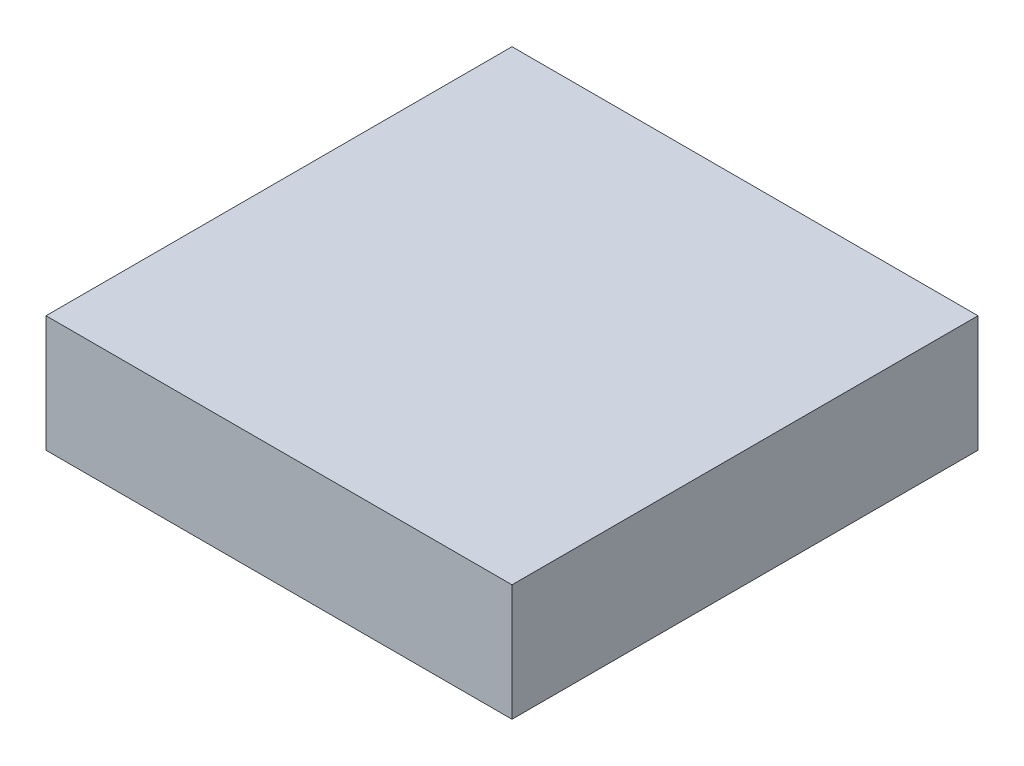
ISO-10303-21;
HEADER;
FILE_DESCRIPTION(('STEP AP214'),'2;1');
FILE_NAME('part.step','',(''),(''),'','','');
FILE_SCHEMA(('AUTOMOTIVE_DESIGN { 1 0 10303 214 1 1 1 1 }'));
ENDSEC;
DATA;
#1=APPLICATION_CONTEXT('core data for automotive mechanical design processes');
#2=APPLICATION_PROTOCOL_DEFINITION('international standard','automotive_design',2000,#1);
#3=PRODUCT_CONTEXT('',#1,'mechanical');
#4=PRODUCT('Part','Part','',(#3));
#5=PRODUCT_RELATED_PRODUCT_CATEGORY('part','',(#4));
#6=PRODUCT_DEFINITION_FORMATION('','',#4);
#7=PRODUCT_DEFINITION_CONTEXT('part definition',#1,'design');
#8=PRODUCT_DEFINITION('design','',#6,#7);
#9=PRODUCT_DEFINITION_SHAPE('','',#8);
#10=(LENGTH_UNIT() NAMED_UNIT(*) SI_UNIT(.MILLI.,.METRE.));
#11=(NAMED_UNIT(*) PLANE_ANGLE_UNIT() SI_UNIT($,.RADIAN.));
#12=(NAMED_UNIT(*) SI_UNIT($,.STERADIAN.) SOLID_ANGLE_UNIT());
#13=UNCERTAINTY_MEASURE_WITH_UNIT(LENGTH_MEASURE(1.E-05),#10,'distance_accuracy_value','');
#14=(GEOMETRIC_REPRESENTATION_CONTEXT(3) GLOBAL_UNCERTAINTY_ASSIGNED_CONTEXT((#13)) GLOBAL_UNIT_ASSIGNED_CONTEXT((#10,
#11,#12)) REPRESENTATION_CONTEXT('',''));
#15=CARTESIAN_POINT('',(0.,0.,0.));
#16=DIRECTION('',(0.,0.,1.));
#17=DIRECTION('',(1.,0.,0.));
#18=AXIS2_PLACEMENT_3D('',#15,#16,#17);
#19=CARTESIAN_POINT('',(-0.886029411764705,0.5,-0.983455882352941));
#20=DIRECTION('',(1.,0.,0.));
#21=DIRECTION('',(0.,0.,-1.));
#22=AXIS2_PLACEMENT_3D('',#19,#20,#21);
#23=PLANE('',#22);
#24=DIRECTION('',(0.,0.,1.));
#25=VECTOR('',#24,1.);
#26=CARTESIAN_POINT('',(-0.886029411764705,0.,-0.983455882352941));
#27=LINE('',#26,#25);
#28=CARTESIAN_POINT('',(-0.886029411764705,0.,-0.983455882352941));
#29=VERTEX_POINT('',#28);
#30=CARTESIAN_POINT('',(-0.886029411764705,0.,1.01654411764706));
#31=VERTEX_POINT('',#30);
#32=EDGE_CURVE('E99',#29,#31,#27,.T.);
#33=ORIENTED_EDGE('',*,*,#32,.T.);
#34=DIRECTION('',(0.,-1.,0.));
#35=VECTOR('',#34,1.);
#36=CARTESIAN_POINT('',(-0.886029411764705,0.5,1.01654411764706));
#37=LINE('',#36,#35);
#38=CARTESIAN_POINT('',(-0.886029411764705,0.5,1.01654411764706));
#39=VERTEX_POINT('',#38);
#40=EDGE_CURVE('E11',#39,#31,#37,.T.);
#41=ORIENTED_EDGE('',*,*,#40,.F.);
#42=DIRECTION('',(0.,0.,1.));
#43=VECTOR('',#42,1.);
#44=CARTESIAN_POINT('',(-0.886029411764705,0.5,-0.983455882352941));
#45=LINE('',#44,#43);
#46=CARTESIAN_POINT('',(-0.886029411764705,0.5,-0.983455882352941));
#47=VERTEX_POINT('',#46);
#48=EDGE_CURVE('E88',#47,#39,#45,.T.);
#49=ORIENTED_EDGE('',*,*,#48,.F.);
#50=DIRECTION('',(0.,-1.,0.));
#51=VECTOR('',#50,1.);
#52=CARTESIAN_POINT('',(-0.886029411764705,0.5,-0.983455882352941));
#53=LINE('',#52,#51);
#54=EDGE_CURVE('E96',#47,#29,#53,.T.);
#55=ORIENTED_EDGE('',*,*,#54,.T.);
#56=EDGE_LOOP('',(#33,#41,#49,#55));
#57=FACE_BOUND('',#56,.T.);
#58=ADVANCED_FACE('F40',(#57),#23,.F.);
#59=CARTESIAN_POINT('',(-0.886029411764705,0.5,1.01654411764706));
#60=DIRECTION('',(0.,0.,-1.));
#61=DIRECTION('',(-1.,0.,0.));
#62=AXIS2_PLACEMENT_3D('',#59,#60,#61);
#63=PLANE('',#62);
#64=DIRECTION('',(1.,0.,0.));
#65=VECTOR('',#64,1.);
#66=CARTESIAN_POINT('',(-0.886029411764705,0.,1.01654411764706));
#67=LINE('',#66,#65);
#68=CARTESIAN_POINT('',(1.1139705882353,0.,1.01654411764706));
#69=VERTEX_POINT('',#68);
#70=EDGE_CURVE('E95',#31,#69,#67,.T.);
#71=ORIENTED_EDGE('',*,*,#70,.T.);
#72=DIRECTION('',(0.,-1.,0.));
#73=VECTOR('',#72,1.);
#74=CARTESIAN_POINT('',(1.1139705882353,0.5,1.01654411764706));
#75=LINE('',#74,#73);
#76=CARTESIAN_POINT('',(1.1139705882353,0.5,1.01654411764706));
#77=VERTEX_POINT('',#76);
#78=EDGE_CURVE('E44',#77,#69,#75,.T.);
#79=ORIENTED_EDGE('',*,*,#78,.F.);
#80=DIRECTION('',(1.,0.,0.));
#81=VECTOR('',#80,1.);
#82=CARTESIAN_POINT('',(-0.886029411764705,0.5,1.01654411764706));
#83=LINE('',#82,#81);
#84=EDGE_CURVE('E81',#39,#77,#83,.T.);
#85=ORIENTED_EDGE('',*,*,#84,.F.);
#86=ORIENTED_EDGE('',*,*,#40,.T.);
#87=EDGE_LOOP('',(#71,#79,#85,#86));
#88=FACE_BOUND('',#87,.T.);
#89=ADVANCED_FACE('F91',(#88),#63,.F.);
#90=CARTESIAN_POINT('',(1.1139705882353,0.5,-0.983455882352941));
#91=DIRECTION('',(-1.,0.,0.));
#92=DIRECTION('',(0.,0.,1.));
#93=AXIS2_PLACEMENT_3D('',#90,#91,#92);
#94=PLANE('',#93);
#95=DIRECTION('',(0.,0.,-1.));
#96=VECTOR('',#95,1.);
#97=CARTESIAN_POINT('',(1.1139705882353,0.,-0.983455882352941));
#98=LINE('',#97,#96);
#99=CARTESIAN_POINT('',(1.1139705882353,0.,-0.983455882352941));
#100=VERTEX_POINT('',#99);
#101=EDGE_CURVE('E68',#69,#100,#98,.T.);
#102=ORIENTED_EDGE('',*,*,#101,.T.);
#103=DIRECTION('',(0.,-1.,0.));
#104=VECTOR('',#103,1.);
#105=CARTESIAN_POINT('',(1.1139705882353,0.5,-0.983455882352941));
#106=LINE('',#105,#104);
#107=CARTESIAN_POINT('',(1.1139705882353,0.5,-0.983455882352941));
#108=VERTEX_POINT('',#107);
#109=EDGE_CURVE('E93',#108,#100,#106,.T.);
#110=ORIENTED_EDGE('',*,*,#109,.F.);
#111=DIRECTION('',(0.,0.,-1.));
#112=VECTOR('',#111,1.);
#113=CARTESIAN_POINT('',(1.1139705882353,0.5,-0.983455882352941));
#114=LINE('',#113,#112);
#115=EDGE_CURVE('E86',#77,#108,#114,.T.);
#116=ORIENTED_EDGE('',*,*,#115,.F.);
#117=ORIENTED_EDGE('',*,*,#78,.T.);
#118=EDGE_LOOP('',(#102,#110,#116,#117));
#119=FACE_BOUND('',#118,.T.);
#120=ADVANCED_FACE('F92',(#119),#94,.F.);
#121=CARTESIAN_POINT('',(-0.886029411764705,0.5,-0.983455882352941));
#122=DIRECTION('',(0.,0.,1.));
#123=DIRECTION('',(1.,0.,0.));
#124=AXIS2_PLACEMENT_3D('',#121,#122,#123);
#125=PLANE('',#124);
#126=DIRECTION('',(-1.,0.,0.));
#127=VECTOR('',#126,1.);
#128=CARTESIAN_POINT('',(-0.886029411764705,0.,-0.983455882352941));
#129=LINE('',#128,#127);
#130=EDGE_CURVE('E78',#100,#29,#129,.T.);
#131=ORIENTED_EDGE('',*,*,#130,.T.);
#132=ORIENTED_EDGE('',*,*,#54,.F.);
#133=DIRECTION('',(-1.,0.,0.));
#134=VECTOR('',#133,1.);
#135=CARTESIAN_POINT('',(-0.886029411764705,0.5,-0.983455882352941));
#136=LINE('',#135,#134);
#137=EDGE_CURVE('E52',#108,#47,#136,.T.);
#138=ORIENTED_EDGE('',*,*,#137,.F.);
#139=ORIENTED_EDGE('',*,*,#109,.T.);
#140=EDGE_LOOP('',(#131,#132,#138,#139));
#141=FACE_BOUND('',#140,.T.);
#142=ADVANCED_FACE('F107',(#141),#125,.F.);
#143=CARTESIAN_POINT('',(0.,0.5,0.));
#144=DIRECTION('',(0.,1.,0.));
#145=DIRECTION('',(0.,0.,1.));
#146=AXIS2_PLACEMENT_3D('',#143,#144,#145);
#147=PLANE('',#146);
#148=ORIENTED_EDGE('',*,*,#48,.T.);
#149=ORIENTED_EDGE('',*,*,#84,.T.);
#150=ORIENTED_EDGE('',*,*,#115,.T.);
#151=ORIENTED_EDGE('',*,*,#137,.T.);
#152=EDGE_LOOP('',(#148,#149,#150,#151));
#153=FACE_BOUND('',#152,.T.);
#154=ADVANCED_FACE('F84',(#153),#147,.T.);
#155=CARTESIAN_POINT('',(0.,0.,0.));
#156=DIRECTION('',(0.,1.,0.));
#157=DIRECTION('',(0.,0.,1.));
#158=AXIS2_PLACEMENT_3D('',#155,#156,#157);
#159=PLANE('',#158);
#160=ORIENTED_EDGE('',*,*,#32,.F.);
#161=ORIENTED_EDGE('',*,*,#130,.F.);
#162=ORIENTED_EDGE('',*,*,#101,.F.);
#163=ORIENTED_EDGE('',*,*,#70,.F.);
#164=EDGE_LOOP('',(#160,#161,#162,#163));
#165=FACE_BOUND('',#164,.T.);
#166=ADVANCED_FACE('F110',(#165),#159,.F.);
#167=CLOSED_SHELL('',(#58,#89,#120,#142,#154,#166));
#168=MANIFOLD_SOLID_BREP('B2',#167);
#169=ADVANCED_BREP_SHAPE_REPRESENTATION('',(#18,#168),#14);
#170=SHAPE_DEFINITION_REPRESENTATION(#9,#169);
ENDSEC;
END-ISO-10303-21;
